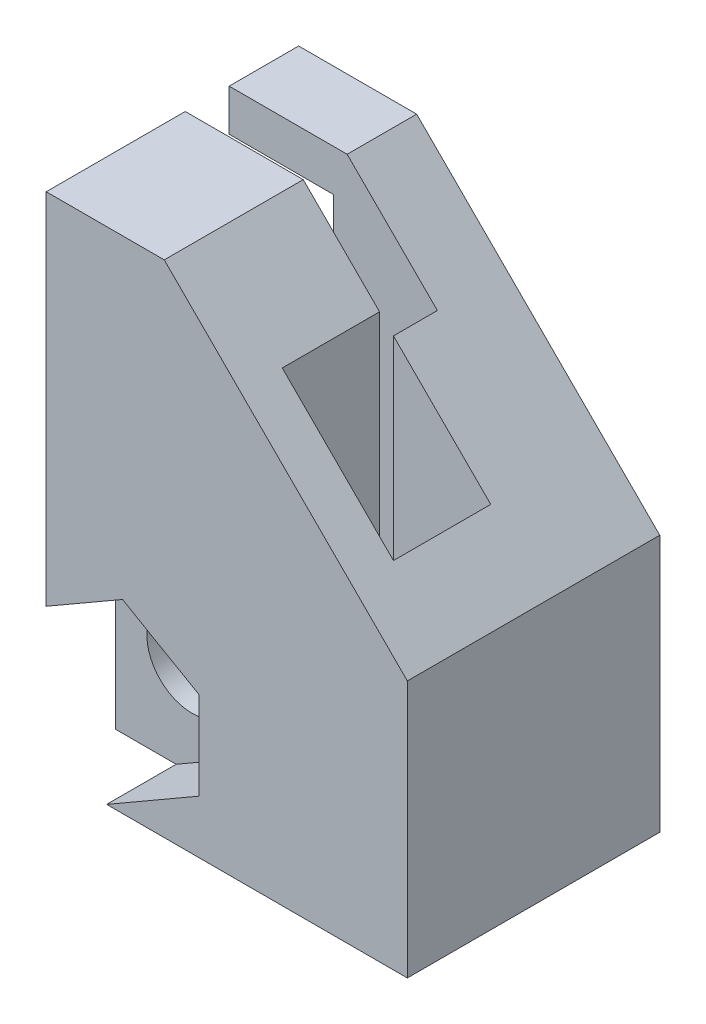
ISO-10303-21;
HEADER;
FILE_DESCRIPTION(('STEP AP214'),'2;1');
FILE_NAME('part.step','',(''),(''),'','','');
FILE_SCHEMA(('AUTOMOTIVE_DESIGN { 1 0 10303 214 1 1 1 1 }'));
ENDSEC;
DATA;
#1=APPLICATION_CONTEXT('core data for automotive mechanical design processes');
#2=APPLICATION_PROTOCOL_DEFINITION('international standard','automotive_design',2000,#1);
#3=PRODUCT_CONTEXT('',#1,'mechanical');
#4=PRODUCT('Part','Part','',(#3));
#5=PRODUCT_RELATED_PRODUCT_CATEGORY('part','',(#4));
#6=PRODUCT_DEFINITION_FORMATION('','',#4);
#7=PRODUCT_DEFINITION_CONTEXT('part definition',#1,'design');
#8=PRODUCT_DEFINITION('design','',#6,#7);
#9=PRODUCT_DEFINITION_SHAPE('','',#8);
#10=(LENGTH_UNIT() NAMED_UNIT(*) SI_UNIT(.MILLI.,.METRE.));
#11=(NAMED_UNIT(*) PLANE_ANGLE_UNIT() SI_UNIT($,.RADIAN.));
#12=(NAMED_UNIT(*) SI_UNIT($,.STERADIAN.) SOLID_ANGLE_UNIT());
#13=UNCERTAINTY_MEASURE_WITH_UNIT(LENGTH_MEASURE(1.E-05),#10,'distance_accuracy_value','');
#14=(GEOMETRIC_REPRESENTATION_CONTEXT(3) GLOBAL_UNCERTAINTY_ASSIGNED_CONTEXT((#13)) GLOBAL_UNIT_ASSIGNED_CONTEXT((#10,
#11,#12)) REPRESENTATION_CONTEXT('',''));
#15=CARTESIAN_POINT('',(0.,0.,0.));
#16=DIRECTION('',(0.,0.,1.));
#17=DIRECTION('',(1.,0.,0.));
#18=AXIS2_PLACEMENT_3D('',#15,#16,#17);
#19=CARTESIAN_POINT('',(196.49984,-70.499935,3.5));
#20=DIRECTION('',(0.,0.,-1.));
#21=DIRECTION('',(-1.,0.,0.));
#22=AXIS2_PLACEMENT_3D('',#19,#20,#21);
#23=CYLINDRICAL_SURFACE('',#22,1.625);
#24=CARTESIAN_POINT('',(196.49984,-70.499935,0.));
#25=DIRECTION('',(0.,0.,1.));
#26=DIRECTION('',(1.,0.,0.));
#27=AXIS2_PLACEMENT_3D('',#24,#25,#26);
#28=CIRCLE('',#27,1.625);
#29=CARTESIAN_POINT('',(198.12484,-70.499935,0.));
#30=VERTEX_POINT('',#29);
#31=EDGE_CURVE('E127',#30,#30,#28,.T.);
#32=ORIENTED_EDGE('',*,*,#31,.F.);
#33=EDGE_LOOP('',(#32));
#34=FACE_BOUND('',#33,.T.);
#35=CARTESIAN_POINT('',(196.49984,-70.499935,2.5));
#36=DIRECTION('',(0.,0.,1.));
#37=DIRECTION('',(1.,0.,0.));
#38=AXIS2_PLACEMENT_3D('',#35,#36,#37);
#39=CIRCLE('',#38,1.625);
#40=CARTESIAN_POINT('',(198.12484,-70.499935,2.5));
#41=VERTEX_POINT('',#40);
#42=EDGE_CURVE('E36',#41,#41,#39,.T.);
#43=ORIENTED_EDGE('',*,*,#42,.T.);
#44=EDGE_LOOP('',(#43));
#45=FACE_BOUND('',#44,.T.);
#46=ADVANCED_FACE('F32',(#34,#45),#23,.F.);
#47=CARTESIAN_POINT('',(0.,0.,3.5));
#48=DIRECTION('',(0.,0.,-1.));
#49=DIRECTION('',(-1.,0.,0.));
#50=AXIS2_PLACEMENT_3D('',#47,#48,#49);
#51=PLANE('',#50);
#52=DIRECTION('',(-0.707106781186547,0.707106781186547,0.));
#53=VECTOR('',#52,1.);
#54=CARTESIAN_POINT('',(197.99984,-55.999935,3.5));
#55=LINE('',#54,#53);
#56=CARTESIAN_POINT('',(204.745140530002,-62.7452355300017,3.5));
#57=VERTEX_POINT('',#56);
#58=CARTESIAN_POINT('',(200.745140530002,-58.7452355300017,3.5));
#59=VERTEX_POINT('',#58);
#60=EDGE_CURVE('E95',#57,#59,#55,.T.);
#61=ORIENTED_EDGE('',*,*,#60,.F.);
#62=DIRECTION('',(-1.47967925876388E-13,-1.,0.));
#63=VECTOR('',#62,1.);
#64=CARTESIAN_POINT('',(204.74514053,-73.999935,3.5));
#65=LINE('',#64,#63);
#66=CARTESIAN_POINT('',(204.74514053,-73.999935,3.5));
#67=VERTEX_POINT('',#66);
#68=EDGE_CURVE('E260',#57,#67,#65,.T.);
#69=ORIENTED_EDGE('',*,*,#68,.T.);
#70=DIRECTION('',(1.,0.,0.));
#71=VECTOR('',#70,1.);
#72=CARTESIAN_POINT('',(206.74514053,-73.999935,3.5));
#73=LINE('',#72,#71);
#74=CARTESIAN_POINT('',(200.74514053,-73.999935,3.5));
#75=VERTEX_POINT('',#74);
#76=EDGE_CURVE('E140',#75,#67,#73,.T.);
#77=ORIENTED_EDGE('',*,*,#76,.F.);
#78=DIRECTION('',(1.09168623099588E-13,1.,0.));
#79=VECTOR('',#78,1.);
#80=CARTESIAN_POINT('',(200.745140530002,-58.7452355300017,3.5));
#81=LINE('',#80,#79);
#82=EDGE_CURVE('E103',#75,#59,#81,.T.);
#83=ORIENTED_EDGE('',*,*,#82,.T.);
#84=EDGE_LOOP('',(#61,#69,#77,#83));
#85=FACE_BOUND('',#84,.T.);
#86=ADVANCED_FACE('F422',(#85),#51,.T.);
#87=CARTESIAN_POINT('',(0.,0.,0.));
#88=DIRECTION('',(0.,0.,-1.));
#89=DIRECTION('',(-1.,0.,0.));
#90=AXIS2_PLACEMENT_3D('',#87,#88,#89);
#91=PLANE('',#90);
#92=DIRECTION('',(-1.,0.,0.));
#93=VECTOR('',#92,1.);
#94=CARTESIAN_POINT('',(193.75453947,-55.999935,0.));
#95=LINE('',#94,#93);
#96=CARTESIAN_POINT('',(197.99984,-55.999935,0.));
#97=VERTEX_POINT('',#96);
#98=CARTESIAN_POINT('',(193.75453947,-55.999935,0.));
#99=VERTEX_POINT('',#98);
#100=EDGE_CURVE('E102',#97,#99,#95,.T.);
#101=ORIENTED_EDGE('',*,*,#100,.F.);
#102=DIRECTION('',(-0.707106781186547,0.707106781186547,0.));
#103=VECTOR('',#102,1.);
#104=CARTESIAN_POINT('',(197.99984,-55.999935,0.));
#105=LINE('',#104,#103);
#106=CARTESIAN_POINT('',(200.745140530002,-58.7452355300017,0.));
#107=VERTEX_POINT('',#106);
#108=EDGE_CURVE('E85',#107,#97,#105,.T.);
#109=ORIENTED_EDGE('',*,*,#108,.F.);
#110=DIRECTION('',(1.09168623099588E-13,1.,0.));
#111=VECTOR('',#110,1.);
#112=CARTESIAN_POINT('',(200.745140530002,-58.7452355300017,0.));
#113=LINE('',#112,#111);
#114=CARTESIAN_POINT('',(200.74514053,-73.999935,0.));
#115=VERTEX_POINT('',#114);
#116=EDGE_CURVE('E77',#115,#107,#113,.T.);
#117=ORIENTED_EDGE('',*,*,#116,.F.);
#118=DIRECTION('',(1.,0.,0.));
#119=VECTOR('',#118,1.);
#120=CARTESIAN_POINT('',(200.74514053,-73.999935,0.));
#121=LINE('',#120,#119);
#122=CARTESIAN_POINT('',(193.75453947,-73.999935,0.));
#123=VERTEX_POINT('',#122);
#124=EDGE_CURVE('E86',#123,#115,#121,.T.);
#125=ORIENTED_EDGE('',*,*,#124,.F.);
#126=DIRECTION('',(0.,-1.,0.));
#127=VECTOR('',#126,1.);
#128=CARTESIAN_POINT('',(193.75453947,-55.999935,0.));
#129=LINE('',#128,#127);
#130=EDGE_CURVE('E121',#99,#123,#129,.T.);
#131=ORIENTED_EDGE('',*,*,#130,.F.);
#132=EDGE_LOOP('',(#101,#109,#117,#125,#131));
#133=FACE_BOUND('',#132,.T.);
#134=ORIENTED_EDGE('',*,*,#31,.T.);
#135=EDGE_LOOP('',(#134));
#136=FACE_BOUND('',#135,.T.);
#137=ADVANCED_FACE('F99',(#133,#136),#91,.T.);
#138=CARTESIAN_POINT('',(193.75453947,-55.999935,3.5));
#139=DIRECTION('',(0.,-1.,0.));
#140=DIRECTION('',(0.,0.,-1.));
#141=AXIS2_PLACEMENT_3D('',#138,#139,#140);
#142=PLANE('',#141);
#143=ORIENTED_EDGE('',*,*,#100,.T.);
#144=DIRECTION('',(0.,0.,-1.));
#145=VECTOR('',#144,1.);
#146=CARTESIAN_POINT('',(193.75453947,-55.999935,3.5));
#147=LINE('',#146,#145);
#148=CARTESIAN_POINT('',(193.75453947,-55.999935,5.));
#149=VERTEX_POINT('',#148);
#150=EDGE_CURVE('E11',#149,#99,#147,.T.);
#151=ORIENTED_EDGE('',*,*,#150,.F.);
#152=DIRECTION('',(-1.,0.,0.));
#153=VECTOR('',#152,1.);
#154=CARTESIAN_POINT('',(193.75453947,-55.999935,5.));
#155=LINE('',#154,#153);
#156=CARTESIAN_POINT('',(197.99984,-55.999935,5.));
#157=VERTEX_POINT('',#156);
#158=EDGE_CURVE('E137',#157,#149,#155,.T.);
#159=ORIENTED_EDGE('',*,*,#158,.F.);
#160=DIRECTION('',(0.,0.,-1.));
#161=VECTOR('',#160,1.);
#162=CARTESIAN_POINT('',(197.99984,-55.999935,3.5));
#163=LINE('',#162,#161);
#164=EDGE_CURVE('E96',#157,#97,#163,.T.);
#165=ORIENTED_EDGE('',*,*,#164,.T.);
#166=EDGE_LOOP('',(#143,#151,#159,#165));
#167=FACE_BOUND('',#166,.T.);
#168=ADVANCED_FACE('F34',(#167),#142,.F.);
#169=CARTESIAN_POINT('',(193.75453947,-55.999935,3.5));
#170=DIRECTION('',(1.,0.,0.));
#171=DIRECTION('',(0.,0.,-1.));
#172=AXIS2_PLACEMENT_3D('',#169,#170,#171);
#173=PLANE('',#172);
#174=DIRECTION('',(0.,-1.,0.));
#175=VECTOR('',#174,1.);
#176=CARTESIAN_POINT('',(193.75453947,-68.9149349999981,2.5));
#177=LINE('',#176,#175);
#178=CARTESIAN_POINT('',(193.75453947,-68.9149349999981,2.5));
#179=VERTEX_POINT('',#178);
#180=CARTESIAN_POINT('',(193.75453947,-73.999935,2.5));
#181=VERTEX_POINT('',#180);
#182=EDGE_CURVE('E297',#179,#181,#177,.T.);
#183=ORIENTED_EDGE('',*,*,#182,.F.);
#184=DIRECTION('',(0.,0.,1.));
#185=VECTOR('',#184,1.);
#186=CARTESIAN_POINT('',(193.75453947,-68.9149349999981,2.5));
#187=LINE('',#186,#185);
#188=CARTESIAN_POINT('',(193.75453947,-68.9149349999981,5.));
#189=VERTEX_POINT('',#188);
#190=EDGE_CURVE('E268',#179,#189,#187,.T.);
#191=ORIENTED_EDGE('',*,*,#190,.T.);
#192=DIRECTION('',(0.,-1.,0.));
#193=VECTOR('',#192,1.);
#194=CARTESIAN_POINT('',(193.75453947,-55.999935,5.));
#195=LINE('',#194,#193);
#196=EDGE_CURVE('E139',#149,#189,#195,.T.);
#197=ORIENTED_EDGE('',*,*,#196,.F.);
#198=ORIENTED_EDGE('',*,*,#150,.T.);
#199=ORIENTED_EDGE('',*,*,#130,.T.);
#200=DIRECTION('',(0.,0.,-1.));
#201=VECTOR('',#200,1.);
#202=CARTESIAN_POINT('',(193.75453947,-73.999935,3.5));
#203=LINE('',#202,#201);
#204=EDGE_CURVE('E41',#181,#123,#203,.T.);
#205=ORIENTED_EDGE('',*,*,#204,.F.);
#206=EDGE_LOOP('',(#183,#191,#197,#198,#199,#205));
#207=FACE_BOUND('',#206,.T.);
#208=ADVANCED_FACE('F122',(#207),#173,.F.);
#209=CARTESIAN_POINT('',(200.74514053,-73.999935,3.5));
#210=DIRECTION('',(0.,1.,0.));
#211=DIRECTION('',(0.,0.,1.));
#212=AXIS2_PLACEMENT_3D('',#209,#210,#211);
#213=PLANE('',#212);
#214=DIRECTION('',(1.,0.,0.));
#215=VECTOR('',#214,1.);
#216=CARTESIAN_POINT('',(206.74514053,-73.999935,5.));
#217=LINE('',#216,#215);
#218=CARTESIAN_POINT('',(195.928263233509,-73.999935,5.));
#219=VERTEX_POINT('',#218);
#220=CARTESIAN_POINT('',(206.74514053,-73.999935,5.));
#221=VERTEX_POINT('',#220);
#222=EDGE_CURVE('E151',#219,#221,#217,.T.);
#223=ORIENTED_EDGE('',*,*,#222,.F.);
#224=DIRECTION('',(0.,0.,1.));
#225=VECTOR('',#224,1.);
#226=CARTESIAN_POINT('',(195.928263233509,-73.999935,2.5));
#227=LINE('',#226,#225);
#228=CARTESIAN_POINT('',(195.928263233509,-73.999935,2.5));
#229=VERTEX_POINT('',#228);
#230=EDGE_CURVE('E272',#229,#219,#227,.T.);
#231=ORIENTED_EDGE('',*,*,#230,.F.);
#232=DIRECTION('',(1.,0.,0.));
#233=VECTOR('',#232,1.);
#234=CARTESIAN_POINT('',(195.928263233509,-73.999935,2.5));
#235=LINE('',#234,#233);
#236=EDGE_CURVE('E118',#181,#229,#235,.T.);
#237=ORIENTED_EDGE('',*,*,#236,.F.);
#238=ORIENTED_EDGE('',*,*,#204,.T.);
#239=ORIENTED_EDGE('',*,*,#124,.T.);
#240=DIRECTION('',(0.,0.,-1.));
#241=VECTOR('',#240,1.);
#242=CARTESIAN_POINT('',(200.74514053,-73.999935,3.5));
#243=LINE('',#242,#241);
#244=EDGE_CURVE('E57',#75,#115,#243,.T.);
#245=ORIENTED_EDGE('',*,*,#244,.F.);
#246=ORIENTED_EDGE('',*,*,#76,.T.);
#247=DIRECTION('',(0.,0.,-1.));
#248=VECTOR('',#247,1.);
#249=CARTESIAN_POINT('',(204.74514053,-73.999935,3.5));
#250=LINE('',#249,#248);
#251=CARTESIAN_POINT('',(204.74514053,-73.999935,0.));
#252=VERTEX_POINT('',#251);
#253=EDGE_CURVE('E257',#67,#252,#250,.T.);
#254=ORIENTED_EDGE('',*,*,#253,.T.);
#255=DIRECTION('',(1.,0.,0.));
#256=VECTOR('',#255,1.);
#257=CARTESIAN_POINT('',(206.74514053,-73.999935,0.));
#258=LINE('',#257,#256);
#259=CARTESIAN_POINT('',(201.24514053,-73.999935,0.));
#260=VERTEX_POINT('',#259);
#261=EDGE_CURVE('E242',#260,#252,#258,.T.);
#262=ORIENTED_EDGE('',*,*,#261,.F.);
#263=DIRECTION('',(0.,0.,-1.));
#264=VECTOR('',#263,1.);
#265=CARTESIAN_POINT('',(201.24514053,-73.999935,0.));
#266=LINE('',#265,#264);
#267=CARTESIAN_POINT('',(201.24514053,-73.999935,-1.58));
#268=VERTEX_POINT('',#267);
#269=EDGE_CURVE('E239',#260,#268,#266,.T.);
#270=ORIENTED_EDGE('',*,*,#269,.T.);
#271=DIRECTION('',(-1.,0.,0.));
#272=VECTOR('',#271,1.);
#273=CARTESIAN_POINT('',(192.49984,-73.999935,-1.58));
#274=LINE('',#273,#272);
#275=CARTESIAN_POINT('',(192.49984,-73.999935,-1.58));
#276=VERTEX_POINT('',#275);
#277=EDGE_CURVE('E204',#268,#276,#274,.T.);
#278=ORIENTED_EDGE('',*,*,#277,.T.);
#279=DIRECTION('',(0.,0.,1.));
#280=VECTOR('',#279,1.);
#281=CARTESIAN_POINT('',(192.49984,-73.999935,-4.08));
#282=LINE('',#281,#280);
#283=CARTESIAN_POINT('',(192.49984,-73.999935,-4.08));
#284=VERTEX_POINT('',#283);
#285=EDGE_CURVE('E142',#284,#276,#282,.T.);
#286=ORIENTED_EDGE('',*,*,#285,.F.);
#287=DIRECTION('',(-1.,0.,0.));
#288=VECTOR('',#287,1.);
#289=CARTESIAN_POINT('',(192.49984,-73.999935,-4.08));
#290=LINE('',#289,#288);
#291=CARTESIAN_POINT('',(206.74514053,-73.999935,-4.08));
#292=VERTEX_POINT('',#291);
#293=EDGE_CURVE('E224',#292,#284,#290,.T.);
#294=ORIENTED_EDGE('',*,*,#293,.F.);
#295=DIRECTION('',(0.,0.,-1.));
#296=VECTOR('',#295,1.);
#297=CARTESIAN_POINT('',(206.74514053,-73.999935,5.));
#298=LINE('',#297,#296);
#299=EDGE_CURVE('E131',#221,#292,#298,.T.);
#300=ORIENTED_EDGE('',*,*,#299,.F.);
#301=EDGE_LOOP('',(#223,#231,#237,#238,#239,#245,#246,#254,#262,#270,#278,#286,#294,#300));
#302=FACE_BOUND('',#301,.T.);
#303=ADVANCED_FACE('F114',(#302),#213,.F.);
#304=CARTESIAN_POINT('',(200.745140530002,-58.7452355300017,3.5));
#305=DIRECTION('',(-1.,1.09168623099588E-13,0.));
#306=DIRECTION('',(-1.09168623099588E-13,-1.,0.));
#307=AXIS2_PLACEMENT_3D('',#304,#305,#306);
#308=PLANE('',#307);
#309=ORIENTED_EDGE('',*,*,#116,.T.);
#310=DIRECTION('',(0.,0.,-1.));
#311=VECTOR('',#310,1.);
#312=CARTESIAN_POINT('',(200.745140530002,-58.7452355300017,3.5));
#313=LINE('',#312,#311);
#314=EDGE_CURVE('E80',#59,#107,#313,.T.);
#315=ORIENTED_EDGE('',*,*,#314,.F.);
#316=ORIENTED_EDGE('',*,*,#82,.F.);
#317=ORIENTED_EDGE('',*,*,#244,.T.);
#318=EDGE_LOOP('',(#309,#315,#316,#317));
#319=FACE_BOUND('',#318,.T.);
#320=ADVANCED_FACE('F79',(#319),#308,.F.);
#321=CARTESIAN_POINT('',(197.99984,-55.999935,3.5));
#322=DIRECTION('',(-0.707106781186548,-0.707106781186548,0.));
#323=DIRECTION('',(0.707106781186548,-0.707106781186548,0.));
#324=AXIS2_PLACEMENT_3D('',#321,#322,#323);
#325=PLANE('',#324);
#326=ORIENTED_EDGE('',*,*,#108,.T.);
#327=ORIENTED_EDGE('',*,*,#164,.F.);
#328=DIRECTION('',(-0.707106781186547,0.707106781186547,0.));
#329=VECTOR('',#328,1.);
#330=CARTESIAN_POINT('',(197.99984,-55.999935,5.));
#331=LINE('',#330,#329);
#332=CARTESIAN_POINT('',(206.745140529998,-64.7452355299983,5.));
#333=VERTEX_POINT('',#332);
#334=EDGE_CURVE('E145',#333,#157,#331,.T.);
#335=ORIENTED_EDGE('',*,*,#334,.F.);
#336=DIRECTION('',(0.,0.,-1.));
#337=VECTOR('',#336,1.);
#338=CARTESIAN_POINT('',(206.745140529998,-64.7452355299983,5.));
#339=LINE('',#338,#337);
#340=CARTESIAN_POINT('',(206.745140529998,-64.7452355299983,-4.08));
#341=VERTEX_POINT('',#340);
#342=EDGE_CURVE('E134',#333,#341,#339,.T.);
#343=ORIENTED_EDGE('',*,*,#342,.T.);
#344=DIRECTION('',(0.707106781186548,-0.707106781186548,0.));
#345=VECTOR('',#344,1.);
#346=CARTESIAN_POINT('',(199.99984,-57.999935,-4.08));
#347=LINE('',#346,#345);
#348=CARTESIAN_POINT('',(197.99984,-55.999935,-4.08));
#349=VERTEX_POINT('',#348);
#350=EDGE_CURVE('E185',#349,#341,#347,.T.);
#351=ORIENTED_EDGE('',*,*,#350,.F.);
#352=DIRECTION('',(0.,0.,1.));
#353=VECTOR('',#352,1.);
#354=CARTESIAN_POINT('',(197.99984,-55.999935,-4.08));
#355=LINE('',#354,#353);
#356=CARTESIAN_POINT('',(197.99984,-55.999935,-1.58));
#357=VERTEX_POINT('',#356);
#358=EDGE_CURVE('E178',#349,#357,#355,.T.);
#359=ORIENTED_EDGE('',*,*,#358,.T.);
#360=DIRECTION('',(0.707106781186547,-0.707106781186547,0.));
#361=VECTOR('',#360,1.);
#362=CARTESIAN_POINT('',(199.99984,-57.999935,-1.58));
#363=LINE('',#362,#361);
#364=CARTESIAN_POINT('',(201.24514053,-59.24523553,-1.58));
#365=VERTEX_POINT('',#364);
#366=EDGE_CURVE('E182',#357,#365,#363,.T.);
#367=ORIENTED_EDGE('',*,*,#366,.T.);
#368=DIRECTION('',(0.,0.,-1.));
#369=VECTOR('',#368,1.);
#370=CARTESIAN_POINT('',(201.24514053,-59.24523553,0.));
#371=LINE('',#370,#369);
#372=CARTESIAN_POINT('',(201.24514053,-59.24523553,0.));
#373=VERTEX_POINT('',#372);
#374=EDGE_CURVE('E236',#373,#365,#371,.T.);
#375=ORIENTED_EDGE('',*,*,#374,.F.);
#376=DIRECTION('',(-0.707106781186548,0.707106781186548,0.));
#377=VECTOR('',#376,1.);
#378=CARTESIAN_POINT('',(206.745140529998,-64.7452355299983,0.));
#379=LINE('',#378,#377);
#380=CARTESIAN_POINT('',(204.745140530002,-62.7452355300017,0.));
#381=VERTEX_POINT('',#380);
#382=EDGE_CURVE('E246',#381,#373,#379,.T.);
#383=ORIENTED_EDGE('',*,*,#382,.F.);
#384=DIRECTION('',(0.,0.,-1.));
#385=VECTOR('',#384,1.);
#386=CARTESIAN_POINT('',(204.745140530002,-62.7452355300017,3.5));
#387=LINE('',#386,#385);
#388=EDGE_CURVE('E247',#57,#381,#387,.T.);
#389=ORIENTED_EDGE('',*,*,#388,.F.);
#390=ORIENTED_EDGE('',*,*,#60,.T.);
#391=ORIENTED_EDGE('',*,*,#314,.T.);
#392=EDGE_LOOP('',(#326,#327,#335,#343,#351,#359,#367,#375,#383,#389,#390,#391));
#393=FACE_BOUND('',#392,.T.);
#394=ADVANCED_FACE('F90',(#393),#325,.F.);
#395=CARTESIAN_POINT('',(0.,0.,5.));
#396=DIRECTION('',(0.,0.,-1.));
#397=DIRECTION('',(-1.,0.,0.));
#398=AXIS2_PLACEMENT_3D('',#395,#396,#397);
#399=PLANE('',#398);
#400=DIRECTION('',(0.,1.,0.));
#401=VECTOR('',#400,1.);
#402=CARTESIAN_POINT('',(199.24514053,-72.0849350000019,5.));
#403=LINE('',#402,#401);
#404=CARTESIAN_POINT('',(199.24514053,-72.0849350000019,5.));
#405=VERTEX_POINT('',#404);
#406=CARTESIAN_POINT('',(199.24514053,-68.9149349999981,5.));
#407=VERTEX_POINT('',#406);
#408=EDGE_CURVE('E280',#405,#407,#403,.T.);
#409=ORIENTED_EDGE('',*,*,#408,.F.);
#410=DIRECTION('',(0.866025403784437,0.500000000000003,0.));
#411=VECTOR('',#410,1.);
#412=CARTESIAN_POINT('',(199.24514053,-72.0849350000019,5.));
#413=LINE('',#412,#411);
#414=EDGE_CURVE('E284',#219,#405,#413,.T.);
#415=ORIENTED_EDGE('',*,*,#414,.F.);
#416=ORIENTED_EDGE('',*,*,#222,.T.);
#417=DIRECTION('',(-1.79944745081758E-13,1.,0.));
#418=VECTOR('',#417,1.);
#419=CARTESIAN_POINT('',(206.745140529998,-64.7452355299983,5.));
#420=LINE('',#419,#418);
#421=EDGE_CURVE('E148',#221,#333,#420,.T.);
#422=ORIENTED_EDGE('',*,*,#421,.T.);
#423=ORIENTED_EDGE('',*,*,#334,.T.);
#424=ORIENTED_EDGE('',*,*,#158,.T.);
#425=ORIENTED_EDGE('',*,*,#196,.T.);
#426=DIRECTION('',(-0.866025403784436,-0.500000000000004,0.));
#427=VECTOR('',#426,1.);
#428=CARTESIAN_POINT('',(196.49984,-67.3299349999961,5.));
#429=LINE('',#428,#427);
#430=CARTESIAN_POINT('',(196.49984,-67.3299349999961,5.));
#431=VERTEX_POINT('',#430);
#432=EDGE_CURVE('E287',#431,#189,#429,.T.);
#433=ORIENTED_EDGE('',*,*,#432,.F.);
#434=DIRECTION('',(-0.866025403784439,0.499999999999999,0.));
#435=VECTOR('',#434,1.);
#436=CARTESIAN_POINT('',(199.24514053,-68.9149349999981,5.));
#437=LINE('',#436,#435);
#438=EDGE_CURVE('E48',#407,#431,#437,.T.);
#439=ORIENTED_EDGE('',*,*,#438,.F.);
#440=EDGE_LOOP('',(#409,#415,#416,#422,#423,#424,#425,#433,#439));
#441=FACE_BOUND('',#440,.T.);
#442=ADVANCED_FACE('F393',(#441),#399,.F.);
#443=CARTESIAN_POINT('',(206.745140529998,-64.7452355299983,5.));
#444=DIRECTION('',(-1.,-1.79944745081758E-13,0.));
#445=DIRECTION('',(1.79944745081758E-13,-1.,0.));
#446=AXIS2_PLACEMENT_3D('',#443,#444,#445);
#447=PLANE('',#446);
#448=ORIENTED_EDGE('',*,*,#299,.T.);
#449=DIRECTION('',(1.79944745081758E-13,-1.,0.));
#450=VECTOR('',#449,1.);
#451=CARTESIAN_POINT('',(206.745140529998,-64.7452355299983,-4.08));
#452=LINE('',#451,#450);
#453=EDGE_CURVE('E227',#341,#292,#452,.T.);
#454=ORIENTED_EDGE('',*,*,#453,.F.);
#455=ORIENTED_EDGE('',*,*,#342,.F.);
#456=ORIENTED_EDGE('',*,*,#421,.F.);
#457=EDGE_LOOP('',(#448,#454,#455,#456));
#458=FACE_BOUND('',#457,.T.);
#459=ADVANCED_FACE('F434',(#458),#447,.F.);
#460=CARTESIAN_POINT('',(0.,0.,-1.58));
#461=DIRECTION('',(0.,0.,-1.));
#462=DIRECTION('',(-1.,0.,0.));
#463=AXIS2_PLACEMENT_3D('',#460,#461,#462);
#464=PLANE('',#463);
#465=CARTESIAN_POINT('',(196.49984,-70.499935,-1.58));
#466=DIRECTION('',(0.,0.,-1.));
#467=DIRECTION('',(-1.,0.,0.));
#468=AXIS2_PLACEMENT_3D('',#465,#466,#467);
#469=CIRCLE('',#468,1.625);
#470=CARTESIAN_POINT('',(194.87484,-70.499935,-1.58));
#471=VERTEX_POINT('',#470);
#472=EDGE_CURVE('E159',#471,#471,#469,.T.);
#473=ORIENTED_EDGE('',*,*,#472,.T.);
#474=EDGE_LOOP('',(#473));
#475=FACE_BOUND('',#474,.T.);
#476=DIRECTION('',(0.,-1.,0.));
#477=VECTOR('',#476,1.);
#478=CARTESIAN_POINT('',(201.24514053,-59.24523553,-1.58));
#479=LINE('',#478,#477);
#480=EDGE_CURVE('E243',#365,#268,#479,.T.);
#481=ORIENTED_EDGE('',*,*,#480,.F.);
#482=ORIENTED_EDGE('',*,*,#366,.F.);
#483=DIRECTION('',(1.,0.,0.));
#484=VECTOR('',#483,1.);
#485=CARTESIAN_POINT('',(197.99984,-55.999935,-1.58));
#486=LINE('',#485,#484);
#487=CARTESIAN_POINT('',(193.75453947,-55.999935,-1.58));
#488=VERTEX_POINT('',#487);
#489=EDGE_CURVE('E186',#488,#357,#486,.T.);
#490=ORIENTED_EDGE('',*,*,#489,.F.);
#491=DIRECTION('',(0.,1.,0.));
#492=VECTOR('',#491,1.);
#493=CARTESIAN_POINT('',(193.75453947,-57.4999350000033,-1.58));
#494=LINE('',#493,#492);
#495=CARTESIAN_POINT('',(193.75453947,-57.4999350000033,-1.58));
#496=VERTEX_POINT('',#495);
#497=EDGE_CURVE('E189',#496,#488,#494,.T.);
#498=ORIENTED_EDGE('',*,*,#497,.F.);
#499=DIRECTION('',(-1.,0.,0.));
#500=VECTOR('',#499,1.);
#501=CARTESIAN_POINT('',(193.75453947,-57.4999350000033,-1.58));
#502=LINE('',#501,#500);
#503=CARTESIAN_POINT('',(197.50453947,-57.4999350000033,-1.58));
#504=VERTEX_POINT('',#503);
#505=EDGE_CURVE('E192',#504,#496,#502,.T.);
#506=ORIENTED_EDGE('',*,*,#505,.F.);
#507=DIRECTION('',(0.,1.,0.));
#508=VECTOR('',#507,1.);
#509=CARTESIAN_POINT('',(197.50453947,-64.7452355299967,-1.58));
#510=LINE('',#509,#508);
#511=CARTESIAN_POINT('',(197.50453947,-64.7452355299967,-1.58));
#512=VERTEX_POINT('',#511);
#513=EDGE_CURVE('E195',#512,#504,#510,.T.);
#514=ORIENTED_EDGE('',*,*,#513,.F.);
#515=DIRECTION('',(1.,0.,0.));
#516=VECTOR('',#515,1.);
#517=CARTESIAN_POINT('',(197.50453947,-64.7452355299967,-1.58));
#518=LINE('',#517,#516);
#519=CARTESIAN_POINT('',(192.49984,-64.7452355299967,-1.58));
#520=VERTEX_POINT('',#519);
#521=EDGE_CURVE('E198',#520,#512,#518,.T.);
#522=ORIENTED_EDGE('',*,*,#521,.F.);
#523=DIRECTION('',(0.,1.,0.));
#524=VECTOR('',#523,1.);
#525=CARTESIAN_POINT('',(192.49984,-64.7452355299967,-1.58));
#526=LINE('',#525,#524);
#527=EDGE_CURVE('E201',#276,#520,#526,.T.);
#528=ORIENTED_EDGE('',*,*,#527,.F.);
#529=ORIENTED_EDGE('',*,*,#277,.F.);
#530=EDGE_LOOP('',(#481,#482,#490,#498,#506,#514,#522,#528,#529));
#531=FACE_BOUND('',#530,.T.);
#532=ADVANCED_FACE('F508',(#475,#531),#464,.F.);
#533=CARTESIAN_POINT('',(0.,0.,-4.08));
#534=DIRECTION('',(0.,0.,-1.));
#535=DIRECTION('',(-1.,0.,0.));
#536=AXIS2_PLACEMENT_3D('',#533,#534,#535);
#537=PLANE('',#536);
#538=CARTESIAN_POINT('',(196.49984,-70.499935,-4.08));
#539=DIRECTION('',(0.,0.,-1.));
#540=DIRECTION('',(-1.,0.,0.));
#541=AXIS2_PLACEMENT_3D('',#538,#539,#540);
#542=CIRCLE('',#541,3.35997123000001);
#543=CARTESIAN_POINT('',(193.13986877,-70.499935,-4.08));
#544=VERTEX_POINT('',#543);
#545=EDGE_CURVE('E160',#544,#544,#542,.T.);
#546=ORIENTED_EDGE('',*,*,#545,.F.);
#547=EDGE_LOOP('',(#546));
#548=FACE_BOUND('',#547,.T.);
#549=ORIENTED_EDGE('',*,*,#350,.T.);
#550=ORIENTED_EDGE('',*,*,#453,.T.);
#551=ORIENTED_EDGE('',*,*,#293,.T.);
#552=DIRECTION('',(0.,1.,0.));
#553=VECTOR('',#552,1.);
#554=CARTESIAN_POINT('',(192.49984,-64.7452355299967,-4.08));
#555=LINE('',#554,#553);
#556=CARTESIAN_POINT('',(192.49984,-64.7452355299967,-4.08));
#557=VERTEX_POINT('',#556);
#558=EDGE_CURVE('E221',#284,#557,#555,.T.);
#559=ORIENTED_EDGE('',*,*,#558,.T.);
#560=DIRECTION('',(1.,0.,0.));
#561=VECTOR('',#560,1.);
#562=CARTESIAN_POINT('',(197.50453947,-64.7452355299967,-4.08));
#563=LINE('',#562,#561);
#564=CARTESIAN_POINT('',(197.50453947,-64.7452355299967,-4.08));
#565=VERTEX_POINT('',#564);
#566=EDGE_CURVE('E218',#557,#565,#563,.T.);
#567=ORIENTED_EDGE('',*,*,#566,.T.);
#568=DIRECTION('',(0.,1.,0.));
#569=VECTOR('',#568,1.);
#570=CARTESIAN_POINT('',(197.50453947,-64.7452355299967,-4.08));
#571=LINE('',#570,#569);
#572=CARTESIAN_POINT('',(197.50453947,-57.4999350000033,-4.08));
#573=VERTEX_POINT('',#572);
#574=EDGE_CURVE('E215',#565,#573,#571,.T.);
#575=ORIENTED_EDGE('',*,*,#574,.T.);
#576=DIRECTION('',(-1.,0.,0.));
#577=VECTOR('',#576,1.);
#578=CARTESIAN_POINT('',(193.75453947,-57.4999350000033,-4.08));
#579=LINE('',#578,#577);
#580=CARTESIAN_POINT('',(193.75453947,-57.4999350000033,-4.08));
#581=VERTEX_POINT('',#580);
#582=EDGE_CURVE('E212',#573,#581,#579,.T.);
#583=ORIENTED_EDGE('',*,*,#582,.T.);
#584=DIRECTION('',(0.,1.,0.));
#585=VECTOR('',#584,1.);
#586=CARTESIAN_POINT('',(193.75453947,-57.4999350000033,-4.08));
#587=LINE('',#586,#585);
#588=CARTESIAN_POINT('',(193.75453947,-55.999935,-4.08));
#589=VERTEX_POINT('',#588);
#590=EDGE_CURVE('E209',#581,#589,#587,.T.);
#591=ORIENTED_EDGE('',*,*,#590,.T.);
#592=DIRECTION('',(1.,0.,0.));
#593=VECTOR('',#592,1.);
#594=CARTESIAN_POINT('',(197.99984,-55.999935,-4.08));
#595=LINE('',#594,#593);
#596=EDGE_CURVE('E181',#589,#349,#595,.T.);
#597=ORIENTED_EDGE('',*,*,#596,.T.);
#598=EDGE_LOOP('',(#549,#550,#551,#559,#567,#575,#583,#591,#597));
#599=FACE_BOUND('',#598,.T.);
#600=ADVANCED_FACE('F579',(#548,#599),#537,.T.);
#601=CARTESIAN_POINT('',(192.49984,-64.7452355299967,-4.08));
#602=DIRECTION('',(1.,0.,0.));
#603=DIRECTION('',(0.,0.,-1.));
#604=AXIS2_PLACEMENT_3D('',#601,#602,#603);
#605=PLANE('',#604);
#606=ORIENTED_EDGE('',*,*,#527,.T.);
#607=DIRECTION('',(0.,0.,1.));
#608=VECTOR('',#607,1.);
#609=CARTESIAN_POINT('',(192.49984,-64.7452355299967,-4.08));
#610=LINE('',#609,#608);
#611=EDGE_CURVE('E163',#557,#520,#610,.T.);
#612=ORIENTED_EDGE('',*,*,#611,.F.);
#613=ORIENTED_EDGE('',*,*,#558,.F.);
#614=ORIENTED_EDGE('',*,*,#285,.T.);
#615=EDGE_LOOP('',(#606,#612,#613,#614));
#616=FACE_BOUND('',#615,.T.);
#617=ADVANCED_FACE('F582',(#616),#605,.F.);
#618=CARTESIAN_POINT('',(197.50453947,-64.7452355299967,-4.08));
#619=DIRECTION('',(0.,-1.,0.));
#620=DIRECTION('',(0.,0.,-1.));
#621=AXIS2_PLACEMENT_3D('',#618,#619,#620);
#622=PLANE('',#621);
#623=ORIENTED_EDGE('',*,*,#521,.T.);
#624=DIRECTION('',(0.,0.,1.));
#625=VECTOR('',#624,1.);
#626=CARTESIAN_POINT('',(197.50453947,-64.7452355299967,-4.08));
#627=LINE('',#626,#625);
#628=EDGE_CURVE('E166',#565,#512,#627,.T.);
#629=ORIENTED_EDGE('',*,*,#628,.F.);
#630=ORIENTED_EDGE('',*,*,#566,.F.);
#631=ORIENTED_EDGE('',*,*,#611,.T.);
#632=EDGE_LOOP('',(#623,#629,#630,#631));
#633=FACE_BOUND('',#632,.T.);
#634=ADVANCED_FACE('F601',(#633),#622,.F.);
#635=CARTESIAN_POINT('',(197.50453947,-64.7452355299967,-4.08));
#636=DIRECTION('',(1.,0.,0.));
#637=DIRECTION('',(0.,0.,-1.));
#638=AXIS2_PLACEMENT_3D('',#635,#636,#637);
#639=PLANE('',#638);
#640=ORIENTED_EDGE('',*,*,#513,.T.);
#641=DIRECTION('',(0.,0.,1.));
#642=VECTOR('',#641,1.);
#643=CARTESIAN_POINT('',(197.50453947,-57.4999350000033,-4.08));
#644=LINE('',#643,#642);
#645=EDGE_CURVE('E169',#573,#504,#644,.T.);
#646=ORIENTED_EDGE('',*,*,#645,.F.);
#647=ORIENTED_EDGE('',*,*,#574,.F.);
#648=ORIENTED_EDGE('',*,*,#628,.T.);
#649=EDGE_LOOP('',(#640,#646,#647,#648));
#650=FACE_BOUND('',#649,.T.);
#651=ADVANCED_FACE('F597',(#650),#639,.F.);
#652=CARTESIAN_POINT('',(193.75453947,-57.4999350000033,-4.08));
#653=DIRECTION('',(0.,1.,0.));
#654=DIRECTION('',(0.,0.,1.));
#655=AXIS2_PLACEMENT_3D('',#652,#653,#654);
#656=PLANE('',#655);
#657=ORIENTED_EDGE('',*,*,#505,.T.);
#658=DIRECTION('',(0.,0.,1.));
#659=VECTOR('',#658,1.);
#660=CARTESIAN_POINT('',(193.75453947,-57.4999350000033,-4.08));
#661=LINE('',#660,#659);
#662=EDGE_CURVE('E172',#581,#496,#661,.T.);
#663=ORIENTED_EDGE('',*,*,#662,.F.);
#664=ORIENTED_EDGE('',*,*,#582,.F.);
#665=ORIENTED_EDGE('',*,*,#645,.T.);
#666=EDGE_LOOP('',(#657,#663,#664,#665));
#667=FACE_BOUND('',#666,.T.);
#668=ADVANCED_FACE('F593',(#667),#656,.F.);
#669=CARTESIAN_POINT('',(193.75453947,-57.4999350000033,-4.08));
#670=DIRECTION('',(1.,0.,0.));
#671=DIRECTION('',(0.,0.,-1.));
#672=AXIS2_PLACEMENT_3D('',#669,#670,#671);
#673=PLANE('',#672);
#674=ORIENTED_EDGE('',*,*,#497,.T.);
#675=DIRECTION('',(0.,0.,1.));
#676=VECTOR('',#675,1.);
#677=CARTESIAN_POINT('',(193.75453947,-55.999935,-4.08));
#678=LINE('',#677,#676);
#679=EDGE_CURVE('E175',#589,#488,#678,.T.);
#680=ORIENTED_EDGE('',*,*,#679,.F.);
#681=ORIENTED_EDGE('',*,*,#590,.F.);
#682=ORIENTED_EDGE('',*,*,#662,.T.);
#683=EDGE_LOOP('',(#674,#680,#681,#682));
#684=FACE_BOUND('',#683,.T.);
#685=ADVANCED_FACE('F589',(#684),#673,.F.);
#686=CARTESIAN_POINT('',(197.99984,-55.999935,-4.08));
#687=DIRECTION('',(0.,-1.,0.));
#688=DIRECTION('',(0.,0.,-1.));
#689=AXIS2_PLACEMENT_3D('',#686,#687,#688);
#690=PLANE('',#689);
#691=ORIENTED_EDGE('',*,*,#489,.T.);
#692=ORIENTED_EDGE('',*,*,#358,.F.);
#693=ORIENTED_EDGE('',*,*,#596,.F.);
#694=ORIENTED_EDGE('',*,*,#679,.T.);
#695=EDGE_LOOP('',(#691,#692,#693,#694));
#696=FACE_BOUND('',#695,.T.);
#697=ADVANCED_FACE('F577',(#696),#690,.F.);
#698=CARTESIAN_POINT('',(196.49984,-70.499935,-4.08));
#699=DIRECTION('',(0.,0.,1.));
#700=DIRECTION('',(1.,0.,0.));
#701=AXIS2_PLACEMENT_3D('',#698,#699,#700);
#702=CYLINDRICAL_SURFACE('',#701,1.625);
#703=CARTESIAN_POINT('',(196.49984,-70.499935,-2.28338469778049));
#704=DIRECTION('',(0.,0.,-1.));
#705=DIRECTION('',(-1.,0.,0.));
#706=AXIS2_PLACEMENT_3D('',#703,#704,#705);
#707=CIRCLE('',#706,1.625);
#708=CARTESIAN_POINT('',(194.87484,-70.499935,-2.28338469778049));
#709=VERTEX_POINT('',#708);
#710=EDGE_CURVE('E156',#709,#709,#707,.F.);
#711=ORIENTED_EDGE('',*,*,#710,.F.);
#712=EDGE_LOOP('',(#711));
#713=FACE_BOUND('',#712,.T.);
#714=ORIENTED_EDGE('',*,*,#472,.F.);
#715=EDGE_LOOP('',(#714));
#716=FACE_BOUND('',#715,.T.);
#717=ADVANCED_FACE('F573',(#713,#716),#702,.F.);
#718=CARTESIAN_POINT('',(196.49984,-70.499935,-4.08));
#719=DIRECTION('',(0.,0.,-1.));
#720=DIRECTION('',(-1.,0.,0.));
#721=AXIS2_PLACEMENT_3D('',#718,#719,#720);
#722=CONICAL_SURFACE('',#721,3.35997123000001,0.767944870877507);
#723=ORIENTED_EDGE('',*,*,#710,.T.);
#724=EDGE_LOOP('',(#723));
#725=FACE_BOUND('',#724,.T.);
#726=ORIENTED_EDGE('',*,*,#545,.T.);
#727=EDGE_LOOP('',(#726));
#728=FACE_BOUND('',#727,.T.);
#729=ADVANCED_FACE('F569',(#725,#728),#722,.F.);
#730=CARTESIAN_POINT('',(201.24514053,-59.24523553,0.));
#731=DIRECTION('',(1.,0.,0.));
#732=DIRECTION('',(0.,0.,-1.));
#733=AXIS2_PLACEMENT_3D('',#730,#731,#732);
#734=PLANE('',#733);
#735=ORIENTED_EDGE('',*,*,#480,.T.);
#736=ORIENTED_EDGE('',*,*,#269,.F.);
#737=DIRECTION('',(0.,-1.,0.));
#738=VECTOR('',#737,1.);
#739=CARTESIAN_POINT('',(201.24514053,-59.24523553,0.));
#740=LINE('',#739,#738);
#741=EDGE_CURVE('E250',#373,#260,#740,.T.);
#742=ORIENTED_EDGE('',*,*,#741,.F.);
#743=ORIENTED_EDGE('',*,*,#374,.T.);
#744=EDGE_LOOP('',(#735,#736,#742,#743));
#745=FACE_BOUND('',#744,.T.);
#746=ADVANCED_FACE('F565',(#745),#734,.F.);
#747=CARTESIAN_POINT('',(0.,0.,0.));
#748=DIRECTION('',(0.,0.,1.));
#749=DIRECTION('',(1.,0.,0.));
#750=AXIS2_PLACEMENT_3D('',#747,#748,#749);
#751=PLANE('',#750);
#752=DIRECTION('',(-1.47967925876388E-13,-1.,0.));
#753=VECTOR('',#752,1.);
#754=CARTESIAN_POINT('',(204.74514053,-73.999935,0.));
#755=LINE('',#754,#753);
#756=EDGE_CURVE('E261',#381,#252,#755,.T.);
#757=ORIENTED_EDGE('',*,*,#756,.F.);
#758=ORIENTED_EDGE('',*,*,#382,.T.);
#759=ORIENTED_EDGE('',*,*,#741,.T.);
#760=ORIENTED_EDGE('',*,*,#261,.T.);
#761=EDGE_LOOP('',(#757,#758,#759,#760));
#762=FACE_BOUND('',#761,.T.);
#763=ADVANCED_FACE('F561',(#762),#751,.T.);
#764=CARTESIAN_POINT('',(204.74514053,-73.999935,3.5));
#765=DIRECTION('',(1.,-1.47967925876388E-13,0.));
#766=DIRECTION('',(1.47967925876388E-13,1.,0.));
#767=AXIS2_PLACEMENT_3D('',#764,#765,#766);
#768=PLANE('',#767);
#769=ORIENTED_EDGE('',*,*,#756,.T.);
#770=ORIENTED_EDGE('',*,*,#253,.F.);
#771=ORIENTED_EDGE('',*,*,#68,.F.);
#772=ORIENTED_EDGE('',*,*,#388,.T.);
#773=EDGE_LOOP('',(#769,#770,#771,#772));
#774=FACE_BOUND('',#773,.T.);
#775=ADVANCED_FACE('F418',(#774),#768,.F.);
#776=CARTESIAN_POINT('',(199.24514053,-68.9149349999981,2.5));
#777=DIRECTION('',(0.499999999999999,0.866025403784439,0.));
#778=DIRECTION('',(-0.866025403784439,0.499999999999999,0.));
#779=AXIS2_PLACEMENT_3D('',#776,#777,#778);
#780=PLANE('',#779);
#781=ORIENTED_EDGE('',*,*,#438,.T.);
#782=DIRECTION('',(0.,0.,1.));
#783=VECTOR('',#782,1.);
#784=CARTESIAN_POINT('',(196.49984,-67.3299349999961,2.5));
#785=LINE('',#784,#783);
#786=CARTESIAN_POINT('',(196.49984,-67.3299349999961,2.5));
#787=VERTEX_POINT('',#786);
#788=EDGE_CURVE('E266',#787,#431,#785,.T.);
#789=ORIENTED_EDGE('',*,*,#788,.F.);
#790=DIRECTION('',(-0.866025403784439,0.499999999999999,0.));
#791=VECTOR('',#790,1.);
#792=CARTESIAN_POINT('',(199.24514053,-68.9149349999981,2.5));
#793=LINE('',#792,#791);
#794=CARTESIAN_POINT('',(199.24514053,-68.9149349999981,2.5));
#795=VERTEX_POINT('',#794);
#796=EDGE_CURVE('E283',#795,#787,#793,.T.);
#797=ORIENTED_EDGE('',*,*,#796,.F.);
#798=DIRECTION('',(0.,0.,1.));
#799=VECTOR('',#798,1.);
#800=CARTESIAN_POINT('',(199.24514053,-68.9149349999981,2.5));
#801=LINE('',#800,#799);
#802=EDGE_CURVE('E278',#795,#407,#801,.T.);
#803=ORIENTED_EDGE('',*,*,#802,.T.);
#804=EDGE_LOOP('',(#781,#789,#797,#803));
#805=FACE_BOUND('',#804,.T.);
#806=ADVANCED_FACE('F314',(#805),#780,.F.);
#807=CARTESIAN_POINT('',(199.24514053,-72.0849350000019,2.5));
#808=DIRECTION('',(1.,0.,0.));
#809=DIRECTION('',(0.,0.,-1.));
#810=AXIS2_PLACEMENT_3D('',#807,#808,#809);
#811=PLANE('',#810);
#812=ORIENTED_EDGE('',*,*,#408,.T.);
#813=ORIENTED_EDGE('',*,*,#802,.F.);
#814=DIRECTION('',(0.,1.,0.));
#815=VECTOR('',#814,1.);
#816=CARTESIAN_POINT('',(199.24514053,-72.0849350000019,2.5));
#817=LINE('',#816,#815);
#818=CARTESIAN_POINT('',(199.24514053,-72.0849350000019,2.5));
#819=VERTEX_POINT('',#818);
#820=EDGE_CURVE('E269',#819,#795,#817,.T.);
#821=ORIENTED_EDGE('',*,*,#820,.F.);
#822=DIRECTION('',(0.,0.,1.));
#823=VECTOR('',#822,1.);
#824=CARTESIAN_POINT('',(199.24514053,-72.0849350000019,2.5));
#825=LINE('',#824,#823);
#826=EDGE_CURVE('E275',#819,#405,#825,.T.);
#827=ORIENTED_EDGE('',*,*,#826,.T.);
#828=EDGE_LOOP('',(#812,#813,#821,#827));
#829=FACE_BOUND('',#828,.T.);
#830=ADVANCED_FACE('F410',(#829),#811,.F.);
#831=CARTESIAN_POINT('',(199.24514053,-72.0849350000019,2.5));
#832=DIRECTION('',(0.500000000000003,-0.866025403784437,0.));
#833=DIRECTION('',(0.866025403784437,0.500000000000003,0.));
#834=AXIS2_PLACEMENT_3D('',#831,#832,#833);
#835=PLANE('',#834);
#836=ORIENTED_EDGE('',*,*,#414,.T.);
#837=ORIENTED_EDGE('',*,*,#826,.F.);
#838=DIRECTION('',(0.866025403784433,0.500000000000009,0.));
#839=VECTOR('',#838,1.);
#840=CARTESIAN_POINT('',(196.49984,-73.6699350000039,2.5));
#841=LINE('',#840,#839);
#842=EDGE_CURVE('E293',#229,#819,#841,.T.);
#843=ORIENTED_EDGE('',*,*,#842,.F.);
#844=ORIENTED_EDGE('',*,*,#230,.T.);
#845=EDGE_LOOP('',(#836,#837,#843,#844));
#846=FACE_BOUND('',#845,.T.);
#847=ADVANCED_FACE('F404',(#846),#835,.F.);
#848=CARTESIAN_POINT('',(196.49984,-67.3299349999961,2.5));
#849=DIRECTION('',(-0.500000000000004,0.866025403784437,0.));
#850=DIRECTION('',(-0.866025403784437,-0.500000000000004,0.));
#851=AXIS2_PLACEMENT_3D('',#848,#849,#850);
#852=PLANE('',#851);
#853=ORIENTED_EDGE('',*,*,#432,.T.);
#854=ORIENTED_EDGE('',*,*,#190,.F.);
#855=DIRECTION('',(-0.866025403784436,-0.500000000000004,0.));
#856=VECTOR('',#855,1.);
#857=CARTESIAN_POINT('',(196.49984,-67.3299349999961,2.5));
#858=LINE('',#857,#856);
#859=EDGE_CURVE('E300',#787,#179,#858,.T.);
#860=ORIENTED_EDGE('',*,*,#859,.F.);
#861=ORIENTED_EDGE('',*,*,#788,.T.);
#862=EDGE_LOOP('',(#853,#854,#860,#861));
#863=FACE_BOUND('',#862,.T.);
#864=ADVANCED_FACE('F398',(#863),#852,.F.);
#865=CARTESIAN_POINT('',(0.,0.,2.5));
#866=DIRECTION('',(0.,0.,1.));
#867=DIRECTION('',(1.,0.,0.));
#868=AXIS2_PLACEMENT_3D('',#865,#866,#867);
#869=PLANE('',#868);
#870=ORIENTED_EDGE('',*,*,#42,.F.);
#871=EDGE_LOOP('',(#870));
#872=FACE_BOUND('',#871,.T.);
#873=ORIENTED_EDGE('',*,*,#796,.T.);
#874=ORIENTED_EDGE('',*,*,#859,.T.);
#875=ORIENTED_EDGE('',*,*,#182,.T.);
#876=ORIENTED_EDGE('',*,*,#236,.T.);
#877=ORIENTED_EDGE('',*,*,#842,.T.);
#878=ORIENTED_EDGE('',*,*,#820,.T.);
#879=EDGE_LOOP('',(#873,#874,#875,#876,#877,#878));
#880=FACE_BOUND('',#879,.T.);
#881=ADVANCED_FACE('F307',(#872,#880),#869,.T.);
#882=CLOSED_SHELL('',(#46,#86,#137,#168,#208,#303,#320,#394,#442,#459,#532,#600,#617,#634,#651,
#668,#685,#697,#717,#729,#746,#763,#775,#806,#830,#847,#864,#881));
#883=MANIFOLD_SOLID_BREP('B2',#882);
#884=ADVANCED_BREP_SHAPE_REPRESENTATION('',(#18,#883),#14);
#885=SHAPE_DEFINITION_REPRESENTATION(#9,#884);
ENDSEC;
END-ISO-10303-21;
